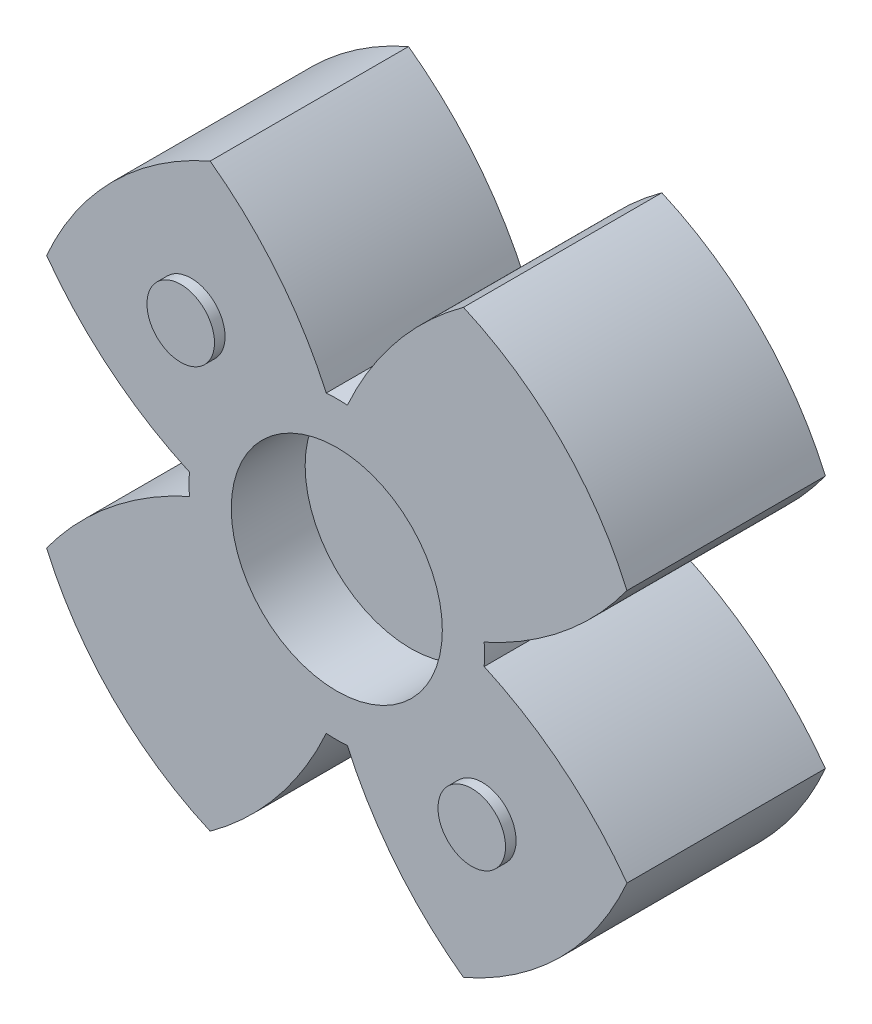
ISO-10303-21;
HEADER;
FILE_DESCRIPTION(('STEP AP214'),'2;1');
FILE_NAME('part.step','',(''),(''),'','','');
FILE_SCHEMA(('AUTOMOTIVE_DESIGN { 1 0 10303 214 1 1 1 1 }'));
ENDSEC;
DATA;
#1=APPLICATION_CONTEXT('core data for automotive mechanical design processes');
#2=APPLICATION_PROTOCOL_DEFINITION('international standard','automotive_design',2000,#1);
#3=PRODUCT_CONTEXT('',#1,'mechanical');
#4=PRODUCT('Part','Part','',(#3));
#5=PRODUCT_RELATED_PRODUCT_CATEGORY('part','',(#4));
#6=PRODUCT_DEFINITION_FORMATION('','',#4);
#7=PRODUCT_DEFINITION_CONTEXT('part definition',#1,'design');
#8=PRODUCT_DEFINITION('design','',#6,#7);
#9=PRODUCT_DEFINITION_SHAPE('','',#8);
#10=(LENGTH_UNIT() NAMED_UNIT(*) SI_UNIT(.MILLI.,.METRE.));
#11=(NAMED_UNIT(*) PLANE_ANGLE_UNIT() SI_UNIT($,.RADIAN.));
#12=(NAMED_UNIT(*) SI_UNIT($,.STERADIAN.) SOLID_ANGLE_UNIT());
#13=UNCERTAINTY_MEASURE_WITH_UNIT(LENGTH_MEASURE(1.E-05),#10,'distance_accuracy_value','');
#14=(GEOMETRIC_REPRESENTATION_CONTEXT(3) GLOBAL_UNCERTAINTY_ASSIGNED_CONTEXT((#13)) GLOBAL_UNIT_ASSIGNED_CONTEXT((#10,
#11,#12)) REPRESENTATION_CONTEXT('',''));
#15=CARTESIAN_POINT('',(0.,0.,0.));
#16=DIRECTION('',(0.,0.,1.));
#17=DIRECTION('',(1.,0.,0.));
#18=AXIS2_PLACEMENT_3D('',#15,#16,#17);
#19=CARTESIAN_POINT('',(0.,0.,9.4));
#20=DIRECTION('',(0.,0.,-1.));
#21=DIRECTION('',(-1.,0.,0.));
#22=AXIS2_PLACEMENT_3D('',#19,#20,#21);
#23=CYLINDRICAL_SURFACE('',#22,14.9999999999999);
#24=CARTESIAN_POINT('',(0.,0.,0.));
#25=DIRECTION('',(0.,0.,1.));
#26=DIRECTION('',(1.,0.,0.));
#27=AXIS2_PLACEMENT_3D('',#24,#25,#26);
#28=CIRCLE('',#27,14.9999999999999);
#29=CARTESIAN_POINT('',(-13.7477270848675,-6.00000000000004,0.));
#30=VERTEX_POINT('',#29);
#31=CARTESIAN_POINT('',(-6.00000000000002,-13.7477270848674,0.));
#32=VERTEX_POINT('',#31);
#33=EDGE_CURVE('E182',#30,#32,#28,.T.);
#34=ORIENTED_EDGE('',*,*,#33,.T.);
#35=DIRECTION('',(0.,0.,-1.));
#36=VECTOR('',#35,1.);
#37=CARTESIAN_POINT('',(-6.00000000000002,-13.7477270848674,9.4));
#38=LINE('',#37,#36);
#39=CARTESIAN_POINT('',(-6.00000000000002,-13.7477270848674,9.4));
#40=VERTEX_POINT('',#39);
#41=EDGE_CURVE('E250',#40,#32,#38,.T.);
#42=ORIENTED_EDGE('',*,*,#41,.F.);
#43=CARTESIAN_POINT('',(0.,0.,9.4));
#44=DIRECTION('',(0.,0.,1.));
#45=DIRECTION('',(1.,0.,0.));
#46=AXIS2_PLACEMENT_3D('',#43,#44,#45);
#47=CIRCLE('',#46,14.9999999999999);
#48=CARTESIAN_POINT('',(-13.7477270848675,-6.00000000000004,9.4));
#49=VERTEX_POINT('',#48);
#50=EDGE_CURVE('E213',#49,#40,#47,.T.);
#51=ORIENTED_EDGE('',*,*,#50,.F.);
#52=DIRECTION('',(0.,0.,-1.));
#53=VECTOR('',#52,1.);
#54=CARTESIAN_POINT('',(-13.7477270848675,-6.00000000000004,9.4));
#55=LINE('',#54,#53);
#56=EDGE_CURVE('E178',#49,#30,#55,.T.);
#57=ORIENTED_EDGE('',*,*,#56,.T.);
#58=EDGE_LOOP('',(#34,#42,#51,#57));
#59=FACE_BOUND('',#58,.T.);
#60=ADVANCED_FACE('F37',(#59),#23,.T.);
#61=CARTESIAN_POINT('',(-16.,0.,9.4));
#62=DIRECTION('',(0.,0.,-1.));
#63=DIRECTION('',(-1.,0.,0.));
#64=AXIS2_PLACEMENT_3D('',#61,#62,#63);
#65=CYLINDRICAL_SURFACE('',#64,17.);
#66=CARTESIAN_POINT('',(-16.,0.,0.));
#67=DIRECTION('',(0.,0.,1.));
#68=DIRECTION('',(1.,0.,0.));
#69=AXIS2_PLACEMENT_3D('',#66,#67,#68);
#70=CIRCLE('',#69,17.);
#71=CARTESIAN_POINT('',(-0.500000000000009,-6.98212002188439,0.));
#72=VERTEX_POINT('',#71);
#73=EDGE_CURVE('E185',#32,#72,#70,.T.);
#74=ORIENTED_EDGE('',*,*,#73,.T.);
#75=DIRECTION('',(0.,0.,-1.));
#76=VECTOR('',#75,1.);
#77=CARTESIAN_POINT('',(-0.500000000000009,-6.98212002188439,9.4));
#78=LINE('',#77,#76);
#79=CARTESIAN_POINT('',(-0.500000000000009,-6.98212002188439,9.4));
#80=VERTEX_POINT('',#79);
#81=EDGE_CURVE('E247',#80,#72,#78,.T.);
#82=ORIENTED_EDGE('',*,*,#81,.F.);
#83=CARTESIAN_POINT('',(-16.,0.,9.4));
#84=DIRECTION('',(0.,0.,1.));
#85=DIRECTION('',(1.,0.,0.));
#86=AXIS2_PLACEMENT_3D('',#83,#84,#85);
#87=CIRCLE('',#86,17.);
#88=EDGE_CURVE('E121',#40,#80,#87,.T.);
#89=ORIENTED_EDGE('',*,*,#88,.F.);
#90=ORIENTED_EDGE('',*,*,#41,.T.);
#91=EDGE_LOOP('',(#74,#82,#89,#90));
#92=FACE_BOUND('',#91,.T.);
#93=ADVANCED_FACE('F282',(#92),#65,.T.);
#94=CARTESIAN_POINT('',(0.,0.,9.4));
#95=DIRECTION('',(0.,0.,-1.));
#96=DIRECTION('',(-1.,0.,0.));
#97=AXIS2_PLACEMENT_3D('',#94,#95,#96);
#98=CYLINDRICAL_SURFACE('',#97,6.99999999999992);
#99=CARTESIAN_POINT('',(0.,0.,0.));
#100=DIRECTION('',(0.,0.,1.));
#101=DIRECTION('',(1.,0.,0.));
#102=AXIS2_PLACEMENT_3D('',#99,#100,#101);
#103=CIRCLE('',#102,6.99999999999992);
#104=CARTESIAN_POINT('',(0.499999999999795,-6.9821200218844,0.));
#105=VERTEX_POINT('',#104);
#106=EDGE_CURVE('E188',#72,#105,#103,.T.);
#107=ORIENTED_EDGE('',*,*,#106,.T.);
#108=DIRECTION('',(0.,0.,-1.));
#109=VECTOR('',#108,1.);
#110=CARTESIAN_POINT('',(0.499999999999795,-6.9821200218844,9.4));
#111=LINE('',#110,#109);
#112=CARTESIAN_POINT('',(0.499999999999795,-6.9821200218844,9.4));
#113=VERTEX_POINT('',#112);
#114=EDGE_CURVE('E244',#113,#105,#111,.T.);
#115=ORIENTED_EDGE('',*,*,#114,.F.);
#116=CARTESIAN_POINT('',(0.,0.,9.4));
#117=DIRECTION('',(0.,0.,1.));
#118=DIRECTION('',(1.,0.,0.));
#119=AXIS2_PLACEMENT_3D('',#116,#117,#118);
#120=CIRCLE('',#119,6.99999999999992);
#121=EDGE_CURVE('E511',#80,#113,#120,.T.);
#122=ORIENTED_EDGE('',*,*,#121,.F.);
#123=ORIENTED_EDGE('',*,*,#81,.T.);
#124=EDGE_LOOP('',(#107,#115,#122,#123));
#125=FACE_BOUND('',#124,.T.);
#126=ADVANCED_FACE('F286',(#125),#98,.T.);
#127=CARTESIAN_POINT('',(15.9999999999999,-1.47555934802184E-13,9.4));
#128=DIRECTION('',(0.,0.,-1.));
#129=DIRECTION('',(-1.,0.,0.));
#130=AXIS2_PLACEMENT_3D('',#127,#128,#129);
#131=CYLINDRICAL_SURFACE('',#130,17.);
#132=CARTESIAN_POINT('',(15.9999999999999,-1.47555934802184E-13,0.));
#133=DIRECTION('',(0.,0.,1.));
#134=DIRECTION('',(1.,0.,0.));
#135=AXIS2_PLACEMENT_3D('',#132,#133,#134);
#136=CIRCLE('',#135,17.);
#137=CARTESIAN_POINT('',(5.99999999999969,-13.7477270848675,0.));
#138=VERTEX_POINT('',#137);
#139=EDGE_CURVE('E190',#105,#138,#136,.T.);
#140=ORIENTED_EDGE('',*,*,#139,.T.);
#141=DIRECTION('',(0.,0.,-1.));
#142=VECTOR('',#141,1.);
#143=CARTESIAN_POINT('',(5.99999999999969,-13.7477270848675,9.4));
#144=LINE('',#143,#142);
#145=CARTESIAN_POINT('',(5.99999999999969,-13.7477270848675,9.4));
#146=VERTEX_POINT('',#145);
#147=EDGE_CURVE('E241',#146,#138,#144,.T.);
#148=ORIENTED_EDGE('',*,*,#147,.F.);
#149=CARTESIAN_POINT('',(15.9999999999999,-1.47555934802184E-13,9.4));
#150=DIRECTION('',(0.,0.,1.));
#151=DIRECTION('',(1.,0.,0.));
#152=AXIS2_PLACEMENT_3D('',#149,#150,#151);
#153=CIRCLE('',#152,17.);
#154=EDGE_CURVE('E513',#113,#146,#153,.T.);
#155=ORIENTED_EDGE('',*,*,#154,.F.);
#156=ORIENTED_EDGE('',*,*,#114,.T.);
#157=EDGE_LOOP('',(#140,#148,#155,#156));
#158=FACE_BOUND('',#157,.T.);
#159=ADVANCED_FACE('F290',(#158),#131,.T.);
#160=CARTESIAN_POINT('',(0.,0.,9.4));
#161=DIRECTION('',(0.,0.,-1.));
#162=DIRECTION('',(-1.,0.,0.));
#163=AXIS2_PLACEMENT_3D('',#160,#161,#162);
#164=CYLINDRICAL_SURFACE('',#163,14.9999999999999);
#165=CARTESIAN_POINT('',(0.,0.,0.));
#166=DIRECTION('',(0.,0.,1.));
#167=DIRECTION('',(1.,0.,0.));
#168=AXIS2_PLACEMENT_3D('',#165,#166,#167);
#169=CIRCLE('',#168,14.9999999999999);
#170=CARTESIAN_POINT('',(13.7477270848675,-5.99999999999975,0.));
#171=VERTEX_POINT('',#170);
#172=EDGE_CURVE('E192',#138,#171,#169,.T.);
#173=ORIENTED_EDGE('',*,*,#172,.T.);
#174=DIRECTION('',(0.,0.,-1.));
#175=VECTOR('',#174,1.);
#176=CARTESIAN_POINT('',(13.7477270848675,-5.99999999999975,9.4));
#177=LINE('',#176,#175);
#178=CARTESIAN_POINT('',(13.7477270848675,-5.99999999999975,9.4));
#179=VERTEX_POINT('',#178);
#180=EDGE_CURVE('E238',#179,#171,#177,.T.);
#181=ORIENTED_EDGE('',*,*,#180,.F.);
#182=CARTESIAN_POINT('',(0.,0.,9.4));
#183=DIRECTION('',(0.,0.,1.));
#184=DIRECTION('',(1.,0.,0.));
#185=AXIS2_PLACEMENT_3D('',#182,#183,#184);
#186=CIRCLE('',#185,14.9999999999999);
#187=EDGE_CURVE('E515',#146,#179,#186,.T.);
#188=ORIENTED_EDGE('',*,*,#187,.F.);
#189=ORIENTED_EDGE('',*,*,#147,.T.);
#190=EDGE_LOOP('',(#173,#181,#188,#189));
#191=FACE_BOUND('',#190,.T.);
#192=ADVANCED_FACE('F296',(#191),#164,.T.);
#193=CARTESIAN_POINT('',(1.5867254497941E-13,-15.9999999999999,9.4));
#194=DIRECTION('',(0.,0.,-1.));
#195=DIRECTION('',(-1.,0.,0.));
#196=AXIS2_PLACEMENT_3D('',#193,#194,#195);
#197=CYLINDRICAL_SURFACE('',#196,17.);
#198=CARTESIAN_POINT('',(1.5867254497941E-13,-15.9999999999999,0.));
#199=DIRECTION('',(0.,0.,1.));
#200=DIRECTION('',(1.,0.,0.));
#201=AXIS2_PLACEMENT_3D('',#198,#199,#200);
#202=CIRCLE('',#201,17.);
#203=CARTESIAN_POINT('',(6.98212002188448,-0.499999999999829,0.));
#204=VERTEX_POINT('',#203);
#205=EDGE_CURVE('E194',#171,#204,#202,.T.);
#206=ORIENTED_EDGE('',*,*,#205,.T.);
#207=DIRECTION('',(0.,0.,-1.));
#208=VECTOR('',#207,1.);
#209=CARTESIAN_POINT('',(6.98212002188448,-0.499999999999829,9.4));
#210=LINE('',#209,#208);
#211=CARTESIAN_POINT('',(6.98212002188448,-0.499999999999829,9.4));
#212=VERTEX_POINT('',#211);
#213=EDGE_CURVE('E235',#212,#204,#210,.T.);
#214=ORIENTED_EDGE('',*,*,#213,.F.);
#215=CARTESIAN_POINT('',(1.5867254497941E-13,-15.9999999999999,9.4));
#216=DIRECTION('',(0.,0.,1.));
#217=DIRECTION('',(1.,0.,0.));
#218=AXIS2_PLACEMENT_3D('',#215,#216,#217);
#219=CIRCLE('',#218,17.);
#220=EDGE_CURVE('E517',#179,#212,#219,.T.);
#221=ORIENTED_EDGE('',*,*,#220,.F.);
#222=ORIENTED_EDGE('',*,*,#180,.T.);
#223=EDGE_LOOP('',(#206,#214,#221,#222));
#224=FACE_BOUND('',#223,.T.);
#225=ADVANCED_FACE('F300',(#224),#197,.T.);
#226=CARTESIAN_POINT('',(0.,0.,9.4));
#227=DIRECTION('',(0.,0.,-1.));
#228=DIRECTION('',(-1.,0.,0.));
#229=AXIS2_PLACEMENT_3D('',#226,#227,#228);
#230=CYLINDRICAL_SURFACE('',#229,7.);
#231=CARTESIAN_POINT('',(0.,0.,0.));
#232=DIRECTION('',(0.,0.,1.));
#233=DIRECTION('',(1.,0.,0.));
#234=AXIS2_PLACEMENT_3D('',#231,#232,#233);
#235=CIRCLE('',#234,7.);
#236=CARTESIAN_POINT('',(6.98212002188447,0.499999999999975,0.));
#237=VERTEX_POINT('',#236);
#238=EDGE_CURVE('E196',#204,#237,#235,.T.);
#239=ORIENTED_EDGE('',*,*,#238,.T.);
#240=DIRECTION('',(0.,0.,-1.));
#241=VECTOR('',#240,1.);
#242=CARTESIAN_POINT('',(6.98212002188447,0.499999999999975,9.4));
#243=LINE('',#242,#241);
#244=CARTESIAN_POINT('',(6.98212002188447,0.499999999999975,9.4));
#245=VERTEX_POINT('',#244);
#246=EDGE_CURVE('E232',#245,#237,#243,.T.);
#247=ORIENTED_EDGE('',*,*,#246,.F.);
#248=CARTESIAN_POINT('',(0.,0.,9.4));
#249=DIRECTION('',(0.,0.,1.));
#250=DIRECTION('',(1.,0.,0.));
#251=AXIS2_PLACEMENT_3D('',#248,#249,#250);
#252=CIRCLE('',#251,7.);
#253=EDGE_CURVE('E519',#212,#245,#252,.T.);
#254=ORIENTED_EDGE('',*,*,#253,.F.);
#255=ORIENTED_EDGE('',*,*,#213,.T.);
#256=EDGE_LOOP('',(#239,#247,#254,#255));
#257=FACE_BOUND('',#256,.T.);
#258=ADVANCED_FACE('F304',(#257),#230,.T.);
#259=CARTESIAN_POINT('',(0.,16.,9.4));
#260=DIRECTION('',(0.,0.,-1.));
#261=DIRECTION('',(-1.,0.,0.));
#262=AXIS2_PLACEMENT_3D('',#259,#260,#261);
#263=CYLINDRICAL_SURFACE('',#262,17.);
#264=CARTESIAN_POINT('',(0.,16.,0.));
#265=DIRECTION('',(0.,0.,1.));
#266=DIRECTION('',(1.,0.,0.));
#267=AXIS2_PLACEMENT_3D('',#264,#265,#266);
#268=CIRCLE('',#267,17.);
#269=CARTESIAN_POINT('',(13.7477270848675,5.99999999999995,0.));
#270=VERTEX_POINT('',#269);
#271=EDGE_CURVE('E198',#237,#270,#268,.T.);
#272=ORIENTED_EDGE('',*,*,#271,.T.);
#273=DIRECTION('',(0.,0.,-1.));
#274=VECTOR('',#273,1.);
#275=CARTESIAN_POINT('',(13.7477270848675,5.99999999999995,9.4));
#276=LINE('',#275,#274);
#277=CARTESIAN_POINT('',(13.7477270848675,5.99999999999995,9.4));
#278=VERTEX_POINT('',#277);
#279=EDGE_CURVE('E229',#278,#270,#276,.T.);
#280=ORIENTED_EDGE('',*,*,#279,.F.);
#281=CARTESIAN_POINT('',(0.,16.,9.4));
#282=DIRECTION('',(0.,0.,1.));
#283=DIRECTION('',(1.,0.,0.));
#284=AXIS2_PLACEMENT_3D('',#281,#282,#283);
#285=CIRCLE('',#284,17.);
#286=EDGE_CURVE('E521',#245,#278,#285,.T.);
#287=ORIENTED_EDGE('',*,*,#286,.F.);
#288=ORIENTED_EDGE('',*,*,#246,.T.);
#289=EDGE_LOOP('',(#272,#280,#287,#288));
#290=FACE_BOUND('',#289,.T.);
#291=ADVANCED_FACE('F308',(#290),#263,.T.);
#292=CARTESIAN_POINT('',(0.,0.,9.4));
#293=DIRECTION('',(0.,0.,-1.));
#294=DIRECTION('',(-1.,0.,0.));
#295=AXIS2_PLACEMENT_3D('',#292,#293,#294);
#296=CYLINDRICAL_SURFACE('',#295,15.);
#297=CARTESIAN_POINT('',(0.,0.,0.));
#298=DIRECTION('',(0.,0.,1.));
#299=DIRECTION('',(1.,0.,0.));
#300=AXIS2_PLACEMENT_3D('',#297,#298,#299);
#301=CIRCLE('',#300,15.);
#302=CARTESIAN_POINT('',(6.00000000000009,13.7477270848675,0.));
#303=VERTEX_POINT('',#302);
#304=EDGE_CURVE('E200',#270,#303,#301,.T.);
#305=ORIENTED_EDGE('',*,*,#304,.T.);
#306=DIRECTION('',(0.,0.,-1.));
#307=VECTOR('',#306,1.);
#308=CARTESIAN_POINT('',(6.00000000000009,13.7477270848675,9.4));
#309=LINE('',#308,#307);
#310=CARTESIAN_POINT('',(6.00000000000009,13.7477270848675,9.4));
#311=VERTEX_POINT('',#310);
#312=EDGE_CURVE('E226',#311,#303,#309,.T.);
#313=ORIENTED_EDGE('',*,*,#312,.F.);
#314=CARTESIAN_POINT('',(0.,0.,9.4));
#315=DIRECTION('',(0.,0.,1.));
#316=DIRECTION('',(1.,0.,0.));
#317=AXIS2_PLACEMENT_3D('',#314,#315,#316);
#318=CIRCLE('',#317,15.);
#319=EDGE_CURVE('E523',#278,#311,#318,.T.);
#320=ORIENTED_EDGE('',*,*,#319,.F.);
#321=ORIENTED_EDGE('',*,*,#279,.T.);
#322=EDGE_LOOP('',(#305,#313,#320,#321));
#323=FACE_BOUND('',#322,.T.);
#324=ADVANCED_FACE('F312',(#323),#296,.T.);
#325=CARTESIAN_POINT('',(15.9999999999999,-1.47555934802184E-13,9.4));
#326=DIRECTION('',(0.,0.,-1.));
#327=DIRECTION('',(-1.,0.,0.));
#328=AXIS2_PLACEMENT_3D('',#325,#326,#327);
#329=CYLINDRICAL_SURFACE('',#328,17.);
#330=CARTESIAN_POINT('',(15.9999999999999,-1.47555934802184E-13,0.));
#331=DIRECTION('',(0.,0.,1.));
#332=DIRECTION('',(1.,0.,0.));
#333=AXIS2_PLACEMENT_3D('',#330,#331,#332);
#334=CIRCLE('',#333,17.);
#335=CARTESIAN_POINT('',(0.499999999999999,6.98212002188455,0.));
#336=VERTEX_POINT('',#335);
#337=EDGE_CURVE('E202',#303,#336,#334,.T.);
#338=ORIENTED_EDGE('',*,*,#337,.T.);
#339=DIRECTION('',(0.,0.,-1.));
#340=VECTOR('',#339,1.);
#341=CARTESIAN_POINT('',(0.499999999999999,6.98212002188455,9.4));
#342=LINE('',#341,#340);
#343=CARTESIAN_POINT('',(0.499999999999999,6.98212002188455,9.4));
#344=VERTEX_POINT('',#343);
#345=EDGE_CURVE('E223',#344,#336,#342,.T.);
#346=ORIENTED_EDGE('',*,*,#345,.F.);
#347=CARTESIAN_POINT('',(15.9999999999999,-1.47555934802184E-13,9.4));
#348=DIRECTION('',(0.,0.,1.));
#349=DIRECTION('',(1.,0.,0.));
#350=AXIS2_PLACEMENT_3D('',#347,#348,#349);
#351=CIRCLE('',#350,17.);
#352=EDGE_CURVE('E525',#311,#344,#351,.T.);
#353=ORIENTED_EDGE('',*,*,#352,.F.);
#354=ORIENTED_EDGE('',*,*,#312,.T.);
#355=EDGE_LOOP('',(#338,#346,#353,#354));
#356=FACE_BOUND('',#355,.T.);
#357=ADVANCED_FACE('F316',(#356),#329,.T.);
#358=CARTESIAN_POINT('',(0.,0.,9.4));
#359=DIRECTION('',(0.,0.,-1.));
#360=DIRECTION('',(-1.,0.,0.));
#361=AXIS2_PLACEMENT_3D('',#358,#359,#360);
#362=CYLINDRICAL_SURFACE('',#361,7.00000000000008);
#363=CARTESIAN_POINT('',(0.,0.,0.));
#364=DIRECTION('',(0.,0.,1.));
#365=DIRECTION('',(1.,0.,0.));
#366=AXIS2_PLACEMENT_3D('',#363,#364,#365);
#367=CIRCLE('',#366,7.00000000000008);
#368=CARTESIAN_POINT('',(-0.500000000000002,6.98212002188455,0.));
#369=VERTEX_POINT('',#368);
#370=EDGE_CURVE('E204',#336,#369,#367,.T.);
#371=ORIENTED_EDGE('',*,*,#370,.T.);
#372=DIRECTION('',(0.,0.,-1.));
#373=VECTOR('',#372,1.);
#374=CARTESIAN_POINT('',(-0.500000000000002,6.98212002188455,9.4));
#375=LINE('',#374,#373);
#376=CARTESIAN_POINT('',(-0.500000000000002,6.98212002188455,9.4));
#377=VERTEX_POINT('',#376);
#378=EDGE_CURVE('E220',#377,#369,#375,.T.);
#379=ORIENTED_EDGE('',*,*,#378,.F.);
#380=CARTESIAN_POINT('',(0.,0.,9.4));
#381=DIRECTION('',(0.,0.,1.));
#382=DIRECTION('',(1.,0.,0.));
#383=AXIS2_PLACEMENT_3D('',#380,#381,#382);
#384=CIRCLE('',#383,7.00000000000008);
#385=EDGE_CURVE('E527',#344,#377,#384,.T.);
#386=ORIENTED_EDGE('',*,*,#385,.F.);
#387=ORIENTED_EDGE('',*,*,#345,.T.);
#388=EDGE_LOOP('',(#371,#379,#386,#387));
#389=FACE_BOUND('',#388,.T.);
#390=ADVANCED_FACE('F320',(#389),#362,.T.);
#391=CARTESIAN_POINT('',(-16.,0.,9.4));
#392=DIRECTION('',(0.,0.,-1.));
#393=DIRECTION('',(-1.,0.,0.));
#394=AXIS2_PLACEMENT_3D('',#391,#392,#393);
#395=CYLINDRICAL_SURFACE('',#394,17.);
#396=CARTESIAN_POINT('',(-16.,0.,0.));
#397=DIRECTION('',(0.,0.,1.));
#398=DIRECTION('',(1.,0.,0.));
#399=AXIS2_PLACEMENT_3D('',#396,#397,#398);
#400=CIRCLE('',#399,17.);
#401=CARTESIAN_POINT('',(-6.,13.7477270848676,0.));
#402=VERTEX_POINT('',#401);
#403=EDGE_CURVE('E206',#369,#402,#400,.T.);
#404=ORIENTED_EDGE('',*,*,#403,.T.);
#405=DIRECTION('',(0.,0.,-1.));
#406=VECTOR('',#405,1.);
#407=CARTESIAN_POINT('',(-6.,13.7477270848676,9.4));
#408=LINE('',#407,#406);
#409=CARTESIAN_POINT('',(-6.,13.7477270848676,9.4));
#410=VERTEX_POINT('',#409);
#411=EDGE_CURVE('E217',#410,#402,#408,.T.);
#412=ORIENTED_EDGE('',*,*,#411,.F.);
#413=CARTESIAN_POINT('',(-16.,0.,9.4));
#414=DIRECTION('',(0.,0.,1.));
#415=DIRECTION('',(1.,0.,0.));
#416=AXIS2_PLACEMENT_3D('',#413,#414,#415);
#417=CIRCLE('',#416,17.);
#418=EDGE_CURVE('E529',#377,#410,#417,.T.);
#419=ORIENTED_EDGE('',*,*,#418,.F.);
#420=ORIENTED_EDGE('',*,*,#378,.T.);
#421=EDGE_LOOP('',(#404,#412,#419,#420));
#422=FACE_BOUND('',#421,.T.);
#423=ADVANCED_FACE('F324',(#422),#395,.T.);
#424=CARTESIAN_POINT('',(0.,0.,9.4));
#425=DIRECTION('',(0.,0.,-1.));
#426=DIRECTION('',(-1.,0.,0.));
#427=AXIS2_PLACEMENT_3D('',#424,#425,#426);
#428=CYLINDRICAL_SURFACE('',#427,15.);
#429=CARTESIAN_POINT('',(0.,0.,0.));
#430=DIRECTION('',(0.,0.,1.));
#431=DIRECTION('',(1.,0.,0.));
#432=AXIS2_PLACEMENT_3D('',#429,#430,#431);
#433=CIRCLE('',#432,15.);
#434=CARTESIAN_POINT('',(-13.7477270848675,6.00000000000007,0.));
#435=VERTEX_POINT('',#434);
#436=EDGE_CURVE('E208',#402,#435,#433,.T.);
#437=ORIENTED_EDGE('',*,*,#436,.T.);
#438=DIRECTION('',(0.,0.,-1.));
#439=VECTOR('',#438,1.);
#440=CARTESIAN_POINT('',(-13.7477270848675,6.00000000000007,9.4));
#441=LINE('',#440,#439);
#442=CARTESIAN_POINT('',(-13.7477270848675,6.00000000000007,9.4));
#443=VERTEX_POINT('',#442);
#444=EDGE_CURVE('E173',#443,#435,#441,.T.);
#445=ORIENTED_EDGE('',*,*,#444,.F.);
#446=CARTESIAN_POINT('',(0.,0.,9.4));
#447=DIRECTION('',(0.,0.,1.));
#448=DIRECTION('',(1.,0.,0.));
#449=AXIS2_PLACEMENT_3D('',#446,#447,#448);
#450=CIRCLE('',#449,15.);
#451=EDGE_CURVE('E164',#410,#443,#450,.T.);
#452=ORIENTED_EDGE('',*,*,#451,.F.);
#453=ORIENTED_EDGE('',*,*,#411,.T.);
#454=EDGE_LOOP('',(#437,#445,#452,#453));
#455=FACE_BOUND('',#454,.T.);
#456=ADVANCED_FACE('F328',(#455),#428,.T.);
#457=CARTESIAN_POINT('',(0.,16.,9.4));
#458=DIRECTION('',(0.,0.,-1.));
#459=DIRECTION('',(-1.,0.,0.));
#460=AXIS2_PLACEMENT_3D('',#457,#458,#459);
#461=CYLINDRICAL_SURFACE('',#460,17.);
#462=CARTESIAN_POINT('',(0.,16.,0.));
#463=DIRECTION('',(0.,0.,1.));
#464=DIRECTION('',(1.,0.,0.));
#465=AXIS2_PLACEMENT_3D('',#462,#463,#464);
#466=CIRCLE('',#465,17.);
#467=CARTESIAN_POINT('',(-6.98212002188447,0.500000000000035,0.));
#468=VERTEX_POINT('',#467);
#469=EDGE_CURVE('E172',#435,#468,#466,.T.);
#470=ORIENTED_EDGE('',*,*,#469,.T.);
#471=DIRECTION('',(0.,0.,-1.));
#472=VECTOR('',#471,1.);
#473=CARTESIAN_POINT('',(-6.98212002188447,0.500000000000035,9.4));
#474=LINE('',#473,#472);
#475=CARTESIAN_POINT('',(-6.98212002188447,0.500000000000035,9.4));
#476=VERTEX_POINT('',#475);
#477=EDGE_CURVE('E169',#476,#468,#474,.T.);
#478=ORIENTED_EDGE('',*,*,#477,.F.);
#479=CARTESIAN_POINT('',(0.,16.,9.4));
#480=DIRECTION('',(0.,0.,1.));
#481=DIRECTION('',(1.,0.,0.));
#482=AXIS2_PLACEMENT_3D('',#479,#480,#481);
#483=CIRCLE('',#482,17.);
#484=EDGE_CURVE('E158',#443,#476,#483,.T.);
#485=ORIENTED_EDGE('',*,*,#484,.F.);
#486=ORIENTED_EDGE('',*,*,#444,.T.);
#487=EDGE_LOOP('',(#470,#478,#485,#486));
#488=FACE_BOUND('',#487,.T.);
#489=ADVANCED_FACE('F170',(#488),#461,.T.);
#490=CARTESIAN_POINT('',(0.,0.,9.4));
#491=DIRECTION('',(0.,0.,-1.));
#492=DIRECTION('',(-1.,0.,0.));
#493=AXIS2_PLACEMENT_3D('',#490,#491,#492);
#494=CYLINDRICAL_SURFACE('',#493,7.);
#495=CARTESIAN_POINT('',(0.,0.,0.));
#496=DIRECTION('',(0.,0.,1.));
#497=DIRECTION('',(1.,0.,0.));
#498=AXIS2_PLACEMENT_3D('',#495,#496,#497);
#499=CIRCLE('',#498,7.);
#500=CARTESIAN_POINT('',(-6.98212002188447,-0.499999999999971,0.));
#501=VERTEX_POINT('',#500);
#502=EDGE_CURVE('E106',#468,#501,#499,.T.);
#503=ORIENTED_EDGE('',*,*,#502,.T.);
#504=DIRECTION('',(0.,0.,-1.));
#505=VECTOR('',#504,1.);
#506=CARTESIAN_POINT('',(-6.98212002188447,-0.499999999999971,9.4));
#507=LINE('',#506,#505);
#508=CARTESIAN_POINT('',(-6.98212002188447,-0.499999999999971,9.4));
#509=VERTEX_POINT('',#508);
#510=EDGE_CURVE('E174',#509,#501,#507,.T.);
#511=ORIENTED_EDGE('',*,*,#510,.F.);
#512=CARTESIAN_POINT('',(0.,0.,9.4));
#513=DIRECTION('',(0.,0.,1.));
#514=DIRECTION('',(1.,0.,0.));
#515=AXIS2_PLACEMENT_3D('',#512,#513,#514);
#516=CIRCLE('',#515,7.);
#517=EDGE_CURVE('E162',#476,#509,#516,.T.);
#518=ORIENTED_EDGE('',*,*,#517,.F.);
#519=ORIENTED_EDGE('',*,*,#477,.T.);
#520=EDGE_LOOP('',(#503,#511,#518,#519));
#521=FACE_BOUND('',#520,.T.);
#522=ADVANCED_FACE('F176',(#521),#494,.T.);
#523=CARTESIAN_POINT('',(1.5867254497941E-13,-15.9999999999999,9.4));
#524=DIRECTION('',(0.,0.,-1.));
#525=DIRECTION('',(-1.,0.,0.));
#526=AXIS2_PLACEMENT_3D('',#523,#524,#525);
#527=CYLINDRICAL_SURFACE('',#526,17.);
#528=CARTESIAN_POINT('',(1.5867254497941E-13,-15.9999999999999,0.));
#529=DIRECTION('',(0.,0.,1.));
#530=DIRECTION('',(1.,0.,0.));
#531=AXIS2_PLACEMENT_3D('',#528,#529,#530);
#532=CIRCLE('',#531,17.);
#533=EDGE_CURVE('E112',#501,#30,#532,.T.);
#534=ORIENTED_EDGE('',*,*,#533,.T.);
#535=ORIENTED_EDGE('',*,*,#56,.F.);
#536=CARTESIAN_POINT('',(1.5867254497941E-13,-15.9999999999999,9.4));
#537=DIRECTION('',(0.,0.,1.));
#538=DIRECTION('',(1.,0.,0.));
#539=AXIS2_PLACEMENT_3D('',#536,#537,#538);
#540=CIRCLE('',#539,17.);
#541=EDGE_CURVE('E53',#509,#49,#540,.T.);
#542=ORIENTED_EDGE('',*,*,#541,.F.);
#543=ORIENTED_EDGE('',*,*,#510,.T.);
#544=EDGE_LOOP('',(#534,#535,#542,#543));
#545=FACE_BOUND('',#544,.T.);
#546=ADVANCED_FACE('F271',(#545),#527,.T.);
#547=CARTESIAN_POINT('',(-8.,0.,9.4));
#548=DIRECTION('',(0.,0.,1.));
#549=DIRECTION('',(1.,0.,0.));
#550=AXIS2_PLACEMENT_3D('',#547,#548,#549);
#551=PLANE('',#550);
#552=CARTESIAN_POINT('',(6.89429111656882,-6.89429111656885,9.4));
#553=DIRECTION('',(0.,0.,1.));
#554=DIRECTION('',(1.,0.,0.));
#555=AXIS2_PLACEMENT_3D('',#552,#553,#554);
#556=CIRCLE('',#555,1.6);
#557=CARTESIAN_POINT('',(8.49429111656883,-6.89429111656885,9.4));
#558=VERTEX_POINT('',#557);
#559=EDGE_CURVE('E486',#558,#558,#556,.T.);
#560=ORIENTED_EDGE('',*,*,#559,.F.);
#561=EDGE_LOOP('',(#560));
#562=FACE_BOUND('',#561,.T.);
#563=CARTESIAN_POINT('',(-6.89429111656883,6.89429111656885,9.4));
#564=DIRECTION('',(0.,0.,1.));
#565=DIRECTION('',(1.,0.,0.));
#566=AXIS2_PLACEMENT_3D('',#563,#564,#565);
#567=CIRCLE('',#566,1.6);
#568=CARTESIAN_POINT('',(-5.29429111656883,6.89429111656885,9.4));
#569=VERTEX_POINT('',#568);
#570=EDGE_CURVE('E492',#569,#569,#567,.T.);
#571=ORIENTED_EDGE('',*,*,#570,.F.);
#572=EDGE_LOOP('',(#571));
#573=FACE_BOUND('',#572,.T.);
#574=CARTESIAN_POINT('',(0.,0.,9.4));
#575=DIRECTION('',(0.,0.,1.));
#576=DIRECTION('',(1.,0.,0.));
#577=AXIS2_PLACEMENT_3D('',#574,#575,#576);
#578=CIRCLE('',#577,5.);
#579=CARTESIAN_POINT('',(5.,0.,9.4));
#580=VERTEX_POINT('',#579);
#581=EDGE_CURVE('E503',#580,#580,#578,.T.);
#582=ORIENTED_EDGE('',*,*,#581,.F.);
#583=EDGE_LOOP('',(#582));
#584=FACE_BOUND('',#583,.T.);
#585=ORIENTED_EDGE('',*,*,#50,.T.);
#586=ORIENTED_EDGE('',*,*,#88,.T.);
#587=ORIENTED_EDGE('',*,*,#121,.T.);
#588=ORIENTED_EDGE('',*,*,#154,.T.);
#589=ORIENTED_EDGE('',*,*,#187,.T.);
#590=ORIENTED_EDGE('',*,*,#220,.T.);
#591=ORIENTED_EDGE('',*,*,#253,.T.);
#592=ORIENTED_EDGE('',*,*,#286,.T.);
#593=ORIENTED_EDGE('',*,*,#319,.T.);
#594=ORIENTED_EDGE('',*,*,#352,.T.);
#595=ORIENTED_EDGE('',*,*,#385,.T.);
#596=ORIENTED_EDGE('',*,*,#418,.T.);
#597=ORIENTED_EDGE('',*,*,#451,.T.);
#598=ORIENTED_EDGE('',*,*,#484,.T.);
#599=ORIENTED_EDGE('',*,*,#517,.T.);
#600=ORIENTED_EDGE('',*,*,#541,.T.);
#601=EDGE_LOOP('',(#585,#586,#587,#588,#589,#590,#591,#592,#593,#594,#595,#596,#597,#598,#599,#600));
#602=FACE_BOUND('',#601,.T.);
#603=ADVANCED_FACE('F160',(#562,#573,#584,#602),#551,.T.);
#604=CARTESIAN_POINT('',(-8.,0.,0.));
#605=DIRECTION('',(0.,0.,1.));
#606=DIRECTION('',(1.,0.,0.));
#607=AXIS2_PLACEMENT_3D('',#604,#605,#606);
#608=PLANE('',#607);
#609=CARTESIAN_POINT('',(-6.89429111656882,-6.89429111656884,0.));
#610=DIRECTION('',(0.,0.,1.));
#611=DIRECTION('',(1.,0.,0.));
#612=AXIS2_PLACEMENT_3D('',#609,#610,#611);
#613=CIRCLE('',#612,1.6);
#614=CARTESIAN_POINT('',(-5.29429111656882,-6.89429111656884,0.));
#615=VERTEX_POINT('',#614);
#616=EDGE_CURVE('E11',#615,#615,#613,.F.);
#617=ORIENTED_EDGE('',*,*,#616,.F.);
#618=EDGE_LOOP('',(#617));
#619=FACE_BOUND('',#618,.T.);
#620=CARTESIAN_POINT('',(6.89429111656883,6.89429111656885,0.));
#621=DIRECTION('',(0.,0.,1.));
#622=DIRECTION('',(1.,0.,0.));
#623=AXIS2_PLACEMENT_3D('',#620,#621,#622);
#624=CIRCLE('',#623,1.6);
#625=CARTESIAN_POINT('',(8.49429111656882,6.89429111656885,0.));
#626=VERTEX_POINT('',#625);
#627=EDGE_CURVE('E45',#626,#626,#624,.F.);
#628=ORIENTED_EDGE('',*,*,#627,.F.);
#629=EDGE_LOOP('',(#628));
#630=FACE_BOUND('',#629,.T.);
#631=CARTESIAN_POINT('',(0.,0.,0.));
#632=DIRECTION('',(0.,0.,-1.));
#633=DIRECTION('',(-1.,0.,0.));
#634=AXIS2_PLACEMENT_3D('',#631,#632,#633);
#635=CIRCLE('',#634,5.);
#636=CARTESIAN_POINT('',(-5.,0.,0.));
#637=VERTEX_POINT('',#636);
#638=EDGE_CURVE('E265',#637,#637,#635,.T.);
#639=ORIENTED_EDGE('',*,*,#638,.F.);
#640=EDGE_LOOP('',(#639));
#641=FACE_BOUND('',#640,.T.);
#642=ORIENTED_EDGE('',*,*,#33,.F.);
#643=ORIENTED_EDGE('',*,*,#533,.F.);
#644=ORIENTED_EDGE('',*,*,#502,.F.);
#645=ORIENTED_EDGE('',*,*,#469,.F.);
#646=ORIENTED_EDGE('',*,*,#436,.F.);
#647=ORIENTED_EDGE('',*,*,#403,.F.);
#648=ORIENTED_EDGE('',*,*,#370,.F.);
#649=ORIENTED_EDGE('',*,*,#337,.F.);
#650=ORIENTED_EDGE('',*,*,#304,.F.);
#651=ORIENTED_EDGE('',*,*,#271,.F.);
#652=ORIENTED_EDGE('',*,*,#238,.F.);
#653=ORIENTED_EDGE('',*,*,#205,.F.);
#654=ORIENTED_EDGE('',*,*,#172,.F.);
#655=ORIENTED_EDGE('',*,*,#139,.F.);
#656=ORIENTED_EDGE('',*,*,#106,.F.);
#657=ORIENTED_EDGE('',*,*,#73,.F.);
#658=EDGE_LOOP('',(#642,#643,#644,#645,#646,#647,#648,#649,#650,#651,#652,#653,#654,#655,#656,#657));
#659=FACE_BOUND('',#658,.T.);
#660=ADVANCED_FACE('F256',(#619,#630,#641,#659),#608,.F.);
#661=CARTESIAN_POINT('',(0.,0.,5.9));
#662=DIRECTION('',(0.,0.,1.));
#663=DIRECTION('',(1.,0.,0.));
#664=AXIS2_PLACEMENT_3D('',#661,#662,#663);
#665=CYLINDRICAL_SURFACE('',#664,5.);
#666=CARTESIAN_POINT('',(0.,0.,5.9));
#667=DIRECTION('',(0.,0.,1.));
#668=DIRECTION('',(1.,0.,0.));
#669=AXIS2_PLACEMENT_3D('',#666,#667,#668);
#670=CIRCLE('',#669,5.);
#671=CARTESIAN_POINT('',(5.,0.,5.9));
#672=VERTEX_POINT('',#671);
#673=EDGE_CURVE('E186',#672,#672,#670,.T.);
#674=ORIENTED_EDGE('',*,*,#673,.F.);
#675=EDGE_LOOP('',(#674));
#676=FACE_BOUND('',#675,.T.);
#677=ORIENTED_EDGE('',*,*,#581,.T.);
#678=EDGE_LOOP('',(#677));
#679=FACE_BOUND('',#678,.T.);
#680=ADVANCED_FACE('F259',(#676,#679),#665,.F.);
#681=CARTESIAN_POINT('',(0.,0.,5.9));
#682=DIRECTION('',(0.,0.,1.));
#683=DIRECTION('',(1.,0.,0.));
#684=AXIS2_PLACEMENT_3D('',#681,#682,#683);
#685=PLANE('',#684);
#686=ORIENTED_EDGE('',*,*,#673,.T.);
#687=EDGE_LOOP('',(#686));
#688=FACE_BOUND('',#687,.T.);
#689=ADVANCED_FACE('F356',(#688),#685,.T.);
#690=CARTESIAN_POINT('',(0.,0.,3.5));
#691=DIRECTION('',(0.,0.,-1.));
#692=DIRECTION('',(-1.,0.,0.));
#693=AXIS2_PLACEMENT_3D('',#690,#691,#692);
#694=CYLINDRICAL_SURFACE('',#693,5.);
#695=CARTESIAN_POINT('',(0.,0.,3.5));
#696=DIRECTION('',(0.,0.,-1.));
#697=DIRECTION('',(-1.,0.,0.));
#698=AXIS2_PLACEMENT_3D('',#695,#696,#697);
#699=CIRCLE('',#698,5.);
#700=CARTESIAN_POINT('',(-5.,0.,3.5));
#701=VERTEX_POINT('',#700);
#702=EDGE_CURVE('E500',#701,#701,#699,.T.);
#703=ORIENTED_EDGE('',*,*,#702,.F.);
#704=EDGE_LOOP('',(#703));
#705=FACE_BOUND('',#704,.T.);
#706=ORIENTED_EDGE('',*,*,#638,.T.);
#707=EDGE_LOOP('',(#706));
#708=FACE_BOUND('',#707,.T.);
#709=ADVANCED_FACE('F367',(#705,#708),#694,.F.);
#710=CARTESIAN_POINT('',(0.,0.,3.5));
#711=DIRECTION('',(0.,0.,-1.));
#712=DIRECTION('',(-1.,0.,0.));
#713=AXIS2_PLACEMENT_3D('',#710,#711,#712);
#714=PLANE('',#713);
#715=ORIENTED_EDGE('',*,*,#702,.T.);
#716=EDGE_LOOP('',(#715));
#717=FACE_BOUND('',#716,.T.);
#718=ADVANCED_FACE('F377',(#717),#714,.T.);
#719=CARTESIAN_POINT('',(-6.89429111656883,6.89429111656885,9.9));
#720=DIRECTION('',(0.,0.,-1.));
#721=DIRECTION('',(-1.,0.,0.));
#722=AXIS2_PLACEMENT_3D('',#719,#720,#721);
#723=CYLINDRICAL_SURFACE('',#722,1.6);
#724=CARTESIAN_POINT('',(-6.89429111656883,6.89429111656885,9.9));
#725=DIRECTION('',(0.,0.,1.));
#726=DIRECTION('',(1.,0.,0.));
#727=AXIS2_PLACEMENT_3D('',#724,#725,#726);
#728=CIRCLE('',#727,1.6);
#729=CARTESIAN_POINT('',(-5.29429111656883,6.89429111656885,9.9));
#730=VERTEX_POINT('',#729);
#731=EDGE_CURVE('E495',#730,#730,#728,.T.);
#732=ORIENTED_EDGE('',*,*,#731,.F.);
#733=EDGE_LOOP('',(#732));
#734=FACE_BOUND('',#733,.T.);
#735=ORIENTED_EDGE('',*,*,#570,.T.);
#736=EDGE_LOOP('',(#735));
#737=FACE_BOUND('',#736,.T.);
#738=ADVANCED_FACE('F387',(#734,#737),#723,.T.);
#739=CARTESIAN_POINT('',(-6.89429111656883,6.89429111656885,9.9));
#740=DIRECTION('',(0.,0.,1.));
#741=DIRECTION('',(1.,0.,0.));
#742=AXIS2_PLACEMENT_3D('',#739,#740,#741);
#743=PLANE('',#742);
#744=ORIENTED_EDGE('',*,*,#731,.T.);
#745=EDGE_LOOP('',(#744));
#746=FACE_BOUND('',#745,.T.);
#747=ADVANCED_FACE('F402',(#746),#743,.T.);
#748=CARTESIAN_POINT('',(6.89429111656882,-6.89429111656885,9.9));
#749=DIRECTION('',(0.,0.,-1.));
#750=DIRECTION('',(-1.,0.,0.));
#751=AXIS2_PLACEMENT_3D('',#748,#749,#750);
#752=CYLINDRICAL_SURFACE('',#751,1.6);
#753=CARTESIAN_POINT('',(6.89429111656882,-6.89429111656885,9.9));
#754=DIRECTION('',(0.,0.,1.));
#755=DIRECTION('',(1.,0.,0.));
#756=AXIS2_PLACEMENT_3D('',#753,#754,#755);
#757=CIRCLE('',#756,1.6);
#758=CARTESIAN_POINT('',(8.49429111656883,-6.89429111656885,9.9));
#759=VERTEX_POINT('',#758);
#760=EDGE_CURVE('E489',#759,#759,#757,.T.);
#761=ORIENTED_EDGE('',*,*,#760,.F.);
#762=EDGE_LOOP('',(#761));
#763=FACE_BOUND('',#762,.T.);
#764=ORIENTED_EDGE('',*,*,#559,.T.);
#765=EDGE_LOOP('',(#764));
#766=FACE_BOUND('',#765,.T.);
#767=ADVANCED_FACE('F412',(#763,#766),#752,.T.);
#768=CARTESIAN_POINT('',(6.89429111656882,-6.89429111656885,9.9));
#769=DIRECTION('',(0.,0.,1.));
#770=DIRECTION('',(1.,0.,0.));
#771=AXIS2_PLACEMENT_3D('',#768,#769,#770);
#772=PLANE('',#771);
#773=ORIENTED_EDGE('',*,*,#760,.T.);
#774=EDGE_LOOP('',(#773));
#775=FACE_BOUND('',#774,.T.);
#776=ADVANCED_FACE('F422',(#775),#772,.T.);
#777=CARTESIAN_POINT('',(6.89429111656883,6.89429111656885,-0.5));
#778=DIRECTION('',(0.,0.,1.));
#779=DIRECTION('',(1.,0.,0.));
#780=AXIS2_PLACEMENT_3D('',#777,#778,#779);
#781=CYLINDRICAL_SURFACE('',#780,1.6);
#782=CARTESIAN_POINT('',(6.89429111656883,6.89429111656885,-0.5));
#783=DIRECTION('',(0.,0.,-1.));
#784=DIRECTION('',(1.,0.,0.));
#785=AXIS2_PLACEMENT_3D('',#782,#783,#784);
#786=CIRCLE('',#785,1.6);
#787=CARTESIAN_POINT('',(8.49429111656882,6.89429111656885,-0.5));
#788=VERTEX_POINT('',#787);
#789=EDGE_CURVE('E483',#788,#788,#786,.T.);
#790=ORIENTED_EDGE('',*,*,#789,.F.);
#791=EDGE_LOOP('',(#790));
#792=FACE_BOUND('',#791,.T.);
#793=ORIENTED_EDGE('',*,*,#627,.T.);
#794=EDGE_LOOP('',(#793));
#795=FACE_BOUND('',#794,.T.);
#796=ADVANCED_FACE('F254',(#792,#795),#781,.T.);
#797=CARTESIAN_POINT('',(6.89429111656883,6.89429111656885,-0.5));
#798=DIRECTION('',(0.,0.,1.));
#799=DIRECTION('',(1.,0.,0.));
#800=AXIS2_PLACEMENT_3D('',#797,#798,#799);
#801=PLANE('',#800);
#802=ORIENTED_EDGE('',*,*,#789,.T.);
#803=EDGE_LOOP('',(#802));
#804=FACE_BOUND('',#803,.T.);
#805=ADVANCED_FACE('F446',(#804),#801,.F.);
#806=CARTESIAN_POINT('',(-6.89429111656882,-6.89429111656884,-0.5));
#807=DIRECTION('',(0.,0.,1.));
#808=DIRECTION('',(1.,0.,0.));
#809=AXIS2_PLACEMENT_3D('',#806,#807,#808);
#810=CYLINDRICAL_SURFACE('',#809,1.6);
#811=CARTESIAN_POINT('',(-6.89429111656882,-6.89429111656884,-0.5));
#812=DIRECTION('',(0.,0.,-1.));
#813=DIRECTION('',(1.,0.,0.));
#814=AXIS2_PLACEMENT_3D('',#811,#812,#813);
#815=CIRCLE('',#814,1.6);
#816=CARTESIAN_POINT('',(-5.29429111656882,-6.89429111656884,-0.5));
#817=VERTEX_POINT('',#816);
#818=EDGE_CURVE('E482',#817,#817,#815,.T.);
#819=ORIENTED_EDGE('',*,*,#818,.F.);
#820=EDGE_LOOP('',(#819));
#821=FACE_BOUND('',#820,.T.);
#822=ORIENTED_EDGE('',*,*,#616,.T.);
#823=EDGE_LOOP('',(#822));
#824=FACE_BOUND('',#823,.T.);
#825=ADVANCED_FACE('F456',(#821,#824),#810,.T.);
#826=CARTESIAN_POINT('',(-6.89429111656882,-6.89429111656884,-0.5));
#827=DIRECTION('',(0.,0.,1.));
#828=DIRECTION('',(1.,0.,0.));
#829=AXIS2_PLACEMENT_3D('',#826,#827,#828);
#830=PLANE('',#829);
#831=ORIENTED_EDGE('',*,*,#818,.T.);
#832=EDGE_LOOP('',(#831));
#833=FACE_BOUND('',#832,.T.);
#834=ADVANCED_FACE('F466',(#833),#830,.F.);
#835=CLOSED_SHELL('',(#60,#93,#126,#159,#192,#225,#258,#291,#324,#357,#390,#423,#456,#489,#522,
#546,#603,#660,#680,#689,#709,#718,#738,#747,#767,#776,#796,#805,#825,#834));
#836=MANIFOLD_SOLID_BREP('B2',#835);
#837=ADVANCED_BREP_SHAPE_REPRESENTATION('',(#18,#836),#14);
#838=SHAPE_DEFINITION_REPRESENTATION(#9,#837);
ENDSEC;
END-ISO-10303-21;
